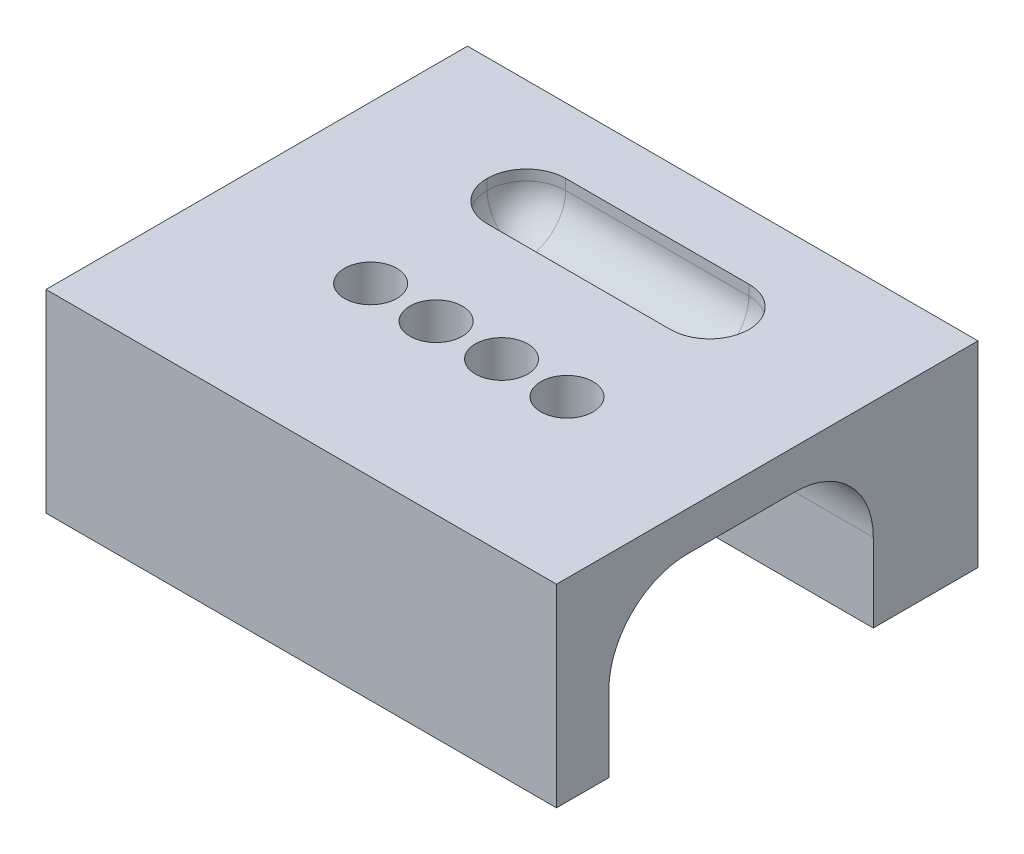
ISO-10303-21;
HEADER;
FILE_DESCRIPTION(('STEP AP214'),'2;1');
FILE_NAME('part.step','',(''),(''),'','','');
FILE_SCHEMA(('AUTOMOTIVE_DESIGN { 1 0 10303 214 1 1 1 1 }'));
ENDSEC;
DATA;
#1=APPLICATION_CONTEXT('core data for automotive mechanical design processes');
#2=APPLICATION_PROTOCOL_DEFINITION('international standard','automotive_design',2000,#1);
#3=PRODUCT_CONTEXT('',#1,'mechanical');
#4=PRODUCT('Part','Part','',(#3));
#5=PRODUCT_RELATED_PRODUCT_CATEGORY('part','',(#4));
#6=PRODUCT_DEFINITION_FORMATION('','',#4);
#7=PRODUCT_DEFINITION_CONTEXT('part definition',#1,'design');
#8=PRODUCT_DEFINITION('design','',#6,#7);
#9=PRODUCT_DEFINITION_SHAPE('','',#8);
#10=(LENGTH_UNIT() NAMED_UNIT(*) SI_UNIT(.MILLI.,.METRE.));
#11=(NAMED_UNIT(*) PLANE_ANGLE_UNIT() SI_UNIT($,.RADIAN.));
#12=(NAMED_UNIT(*) SI_UNIT($,.STERADIAN.) SOLID_ANGLE_UNIT());
#13=UNCERTAINTY_MEASURE_WITH_UNIT(LENGTH_MEASURE(1.E-05),#10,'distance_accuracy_value','');
#14=(GEOMETRIC_REPRESENTATION_CONTEXT(3) GLOBAL_UNCERTAINTY_ASSIGNED_CONTEXT((#13)) GLOBAL_UNIT_ASSIGNED_CONTEXT((#10,
#11,#12)) REPRESENTATION_CONTEXT('',''));
#15=CARTESIAN_POINT('',(0.,0.,0.));
#16=DIRECTION('',(0.,0.,1.));
#17=DIRECTION('',(1.,0.,0.));
#18=AXIS2_PLACEMENT_3D('',#15,#16,#17);
#19=CARTESIAN_POINT('',(4.75000000000001,-6.,0.));
#20=DIRECTION('',(0.,1.,0.));
#21=DIRECTION('',(0.,0.,1.));
#22=AXIS2_PLACEMENT_3D('',#19,#20,#21);
#23=CYLINDRICAL_SURFACE('',#22,1.);
#24=CARTESIAN_POINT('',(4.75000000000001,2.64,0.));
#25=DIRECTION('',(0.,-1.,0.));
#26=DIRECTION('',(0.,0.,-1.));
#27=AXIS2_PLACEMENT_3D('',#24,#25,#26);
#28=CIRCLE('',#27,1.);
#29=CARTESIAN_POINT('',(4.75000000000001,2.64,-1.));
#30=VERTEX_POINT('',#29);
#31=EDGE_CURVE('E164',#30,#30,#28,.F.);
#32=ORIENTED_EDGE('',*,*,#31,.F.);
#33=EDGE_LOOP('',(#32));
#34=FACE_BOUND('',#33,.T.);
#35=CARTESIAN_POINT('',(4.75000000000001,4.14,0.));
#36=DIRECTION('',(0.,1.,0.));
#37=DIRECTION('',(0.,0.,1.));
#38=AXIS2_PLACEMENT_3D('',#35,#36,#37);
#39=CIRCLE('',#38,1.);
#40=CARTESIAN_POINT('',(4.75000000000001,4.14,1.));
#41=VERTEX_POINT('',#40);
#42=EDGE_CURVE('E159',#41,#41,#39,.F.);
#43=ORIENTED_EDGE('',*,*,#42,.F.);
#44=EDGE_LOOP('',(#43));
#45=FACE_BOUND('',#44,.T.);
#46=ADVANCED_FACE('F47',(#34,#45),#23,.F.);
#47=CARTESIAN_POINT('',(-1.25,4.14,6.4));
#48=DIRECTION('',(0.,1.,0.));
#49=DIRECTION('',(0.,0.,1.));
#50=AXIS2_PLACEMENT_3D('',#47,#48,#49);
#51=PLANE('',#50);
#52=CARTESIAN_POINT('',(5.,4.14,-5.7));
#53=DIRECTION('',(0.,1.,0.));
#54=DIRECTION('',(0.,0.,1.));
#55=AXIS2_PLACEMENT_3D('',#52,#53,#54);
#56=CIRCLE('',#55,1.5);
#57=CARTESIAN_POINT('',(5.,4.14,-4.2));
#58=VERTEX_POINT('',#57);
#59=CARTESIAN_POINT('',(3.5,4.14,-5.7));
#60=VERTEX_POINT('',#59);
#61=EDGE_CURVE('E129',#58,#60,#56,.F.);
#62=ORIENTED_EDGE('',*,*,#61,.T.);
#63=CARTESIAN_POINT('',(5.,4.14,-5.7));
#64=DIRECTION('',(0.,1.,0.));
#65=DIRECTION('',(0.,0.,1.));
#66=AXIS2_PLACEMENT_3D('',#63,#64,#65);
#67=CIRCLE('',#66,1.5);
#68=CARTESIAN_POINT('',(5.,4.14,-7.2));
#69=VERTEX_POINT('',#68);
#70=EDGE_CURVE('E126',#60,#69,#67,.F.);
#71=ORIENTED_EDGE('',*,*,#70,.T.);
#72=DIRECTION('',(-1.,0.,0.));
#73=VECTOR('',#72,1.);
#74=CARTESIAN_POINT('',(3.5,4.14,-7.2));
#75=LINE('',#74,#73);
#76=CARTESIAN_POINT('',(12.,4.14,-7.2));
#77=VERTEX_POINT('',#76);
#78=EDGE_CURVE('E271',#77,#69,#75,.T.);
#79=ORIENTED_EDGE('',*,*,#78,.F.);
#80=CARTESIAN_POINT('',(12.,4.14,-5.7));
#81=DIRECTION('',(0.,1.,0.));
#82=DIRECTION('',(0.,0.,1.));
#83=AXIS2_PLACEMENT_3D('',#80,#81,#82);
#84=CIRCLE('',#83,1.5);
#85=CARTESIAN_POINT('',(13.5,4.14,-5.7));
#86=VERTEX_POINT('',#85);
#87=EDGE_CURVE('E57',#77,#86,#84,.F.);
#88=ORIENTED_EDGE('',*,*,#87,.T.);
#89=CARTESIAN_POINT('',(12.,4.14,-5.7));
#90=DIRECTION('',(0.,1.,0.));
#91=DIRECTION('',(0.,0.,1.));
#92=AXIS2_PLACEMENT_3D('',#89,#90,#91);
#93=CIRCLE('',#92,1.5);
#94=CARTESIAN_POINT('',(12.,4.14,-4.2));
#95=VERTEX_POINT('',#94);
#96=EDGE_CURVE('E12',#86,#95,#93,.F.);
#97=ORIENTED_EDGE('',*,*,#96,.T.);
#98=DIRECTION('',(1.,0.,0.));
#99=VECTOR('',#98,1.);
#100=CARTESIAN_POINT('',(3.5,4.14,-4.2));
#101=LINE('',#100,#99);
#102=EDGE_CURVE('E152',#58,#95,#101,.T.);
#103=ORIENTED_EDGE('',*,*,#102,.F.);
#104=EDGE_LOOP('',(#62,#71,#79,#88,#97,#103));
#105=FACE_BOUND('',#104,.T.);
#106=DIRECTION('',(1.,0.,0.));
#107=VECTOR('',#106,1.);
#108=CARTESIAN_POINT('',(-1.25,4.14,-9.7));
#109=LINE('',#108,#107);
#110=CARTESIAN_POINT('',(-1.25,4.14,-9.7));
#111=VERTEX_POINT('',#110);
#112=CARTESIAN_POINT('',(18.25,4.14,-9.7));
#113=VERTEX_POINT('',#112);
#114=EDGE_CURVE('E204',#111,#113,#109,.T.);
#115=ORIENTED_EDGE('',*,*,#114,.F.);
#116=DIRECTION('',(0.,0.,1.));
#117=VECTOR('',#116,1.);
#118=CARTESIAN_POINT('',(-1.25,4.14,6.4));
#119=LINE('',#118,#117);
#120=CARTESIAN_POINT('',(-1.25,4.14,6.4));
#121=VERTEX_POINT('',#120);
#122=EDGE_CURVE('E214',#111,#121,#119,.T.);
#123=ORIENTED_EDGE('',*,*,#122,.T.);
#124=DIRECTION('',(1.,0.,0.));
#125=VECTOR('',#124,1.);
#126=CARTESIAN_POINT('',(-1.25,4.14,6.4));
#127=LINE('',#126,#125);
#128=CARTESIAN_POINT('',(18.25,4.14,6.4));
#129=VERTEX_POINT('',#128);
#130=EDGE_CURVE('E207',#121,#129,#127,.T.);
#131=ORIENTED_EDGE('',*,*,#130,.T.);
#132=DIRECTION('',(0.,0.,1.));
#133=VECTOR('',#132,1.);
#134=CARTESIAN_POINT('',(18.25,4.14,6.4));
#135=LINE('',#134,#133);
#136=EDGE_CURVE('E244',#113,#129,#135,.T.);
#137=ORIENTED_EDGE('',*,*,#136,.F.);
#138=EDGE_LOOP('',(#115,#123,#131,#137));
#139=FACE_BOUND('',#138,.T.);
#140=ORIENTED_EDGE('',*,*,#42,.T.);
#141=EDGE_LOOP('',(#140));
#142=FACE_BOUND('',#141,.T.);
#143=CARTESIAN_POINT('',(7.25000000000001,4.14,0.));
#144=DIRECTION('',(0.,1.,0.));
#145=DIRECTION('',(0.,0.,1.));
#146=AXIS2_PLACEMENT_3D('',#143,#144,#145);
#147=CIRCLE('',#146,1.);
#148=CARTESIAN_POINT('',(7.25000000000001,4.14,1.));
#149=VERTEX_POINT('',#148);
#150=EDGE_CURVE('E162',#149,#149,#147,.F.);
#151=ORIENTED_EDGE('',*,*,#150,.T.);
#152=EDGE_LOOP('',(#151));
#153=FACE_BOUND('',#152,.T.);
#154=CARTESIAN_POINT('',(9.75000000000001,4.14,0.));
#155=DIRECTION('',(0.,1.,0.));
#156=DIRECTION('',(0.,0.,1.));
#157=AXIS2_PLACEMENT_3D('',#154,#155,#156);
#158=CIRCLE('',#157,1.);
#159=CARTESIAN_POINT('',(9.75000000000001,4.14,1.));
#160=VERTEX_POINT('',#159);
#161=EDGE_CURVE('E171',#160,#160,#158,.F.);
#162=ORIENTED_EDGE('',*,*,#161,.T.);
#163=EDGE_LOOP('',(#162));
#164=FACE_BOUND('',#163,.T.);
#165=CARTESIAN_POINT('',(12.25,4.14,0.));
#166=DIRECTION('',(0.,1.,0.));
#167=DIRECTION('',(0.,0.,1.));
#168=AXIS2_PLACEMENT_3D('',#165,#166,#167);
#169=CIRCLE('',#168,1.);
#170=CARTESIAN_POINT('',(12.25,4.14,1.));
#171=VERTEX_POINT('',#170);
#172=EDGE_CURVE('E158',#171,#171,#169,.F.);
#173=ORIENTED_EDGE('',*,*,#172,.T.);
#174=EDGE_LOOP('',(#173));
#175=FACE_BOUND('',#174,.T.);
#176=ADVANCED_FACE('F321',(#105,#139,#142,#153,#164,#175),#51,.T.);
#177=CARTESIAN_POINT('',(-1.25,2.64,0.));
#178=DIRECTION('',(0.,-1.,0.));
#179=DIRECTION('',(0.,0.,-1.));
#180=AXIS2_PLACEMENT_3D('',#177,#178,#179);
#181=PLANE('',#180);
#182=DIRECTION('',(1.,0.,0.));
#183=VECTOR('',#182,1.);
#184=CARTESIAN_POINT('',(-1.25,2.64,1.4));
#185=LINE('',#184,#183);
#186=CARTESIAN_POINT('',(-1.25,2.64,1.4));
#187=VERTEX_POINT('',#186);
#188=CARTESIAN_POINT('',(18.25,2.64,1.4));
#189=VERTEX_POINT('',#188);
#190=EDGE_CURVE('E189',#187,#189,#185,.T.);
#191=ORIENTED_EDGE('',*,*,#190,.F.);
#192=DIRECTION('',(0.,0.,-1.));
#193=VECTOR('',#192,1.);
#194=CARTESIAN_POINT('',(-1.25,2.64,1.4));
#195=LINE('',#194,#193);
#196=CARTESIAN_POINT('',(-1.25,2.64,-2.7));
#197=VERTEX_POINT('',#196);
#198=EDGE_CURVE('E229',#187,#197,#195,.T.);
#199=ORIENTED_EDGE('',*,*,#198,.T.);
#200=DIRECTION('',(1.,0.,0.));
#201=VECTOR('',#200,1.);
#202=CARTESIAN_POINT('',(-1.25,2.64,-2.7));
#203=LINE('',#202,#201);
#204=CARTESIAN_POINT('',(18.25,2.64,-2.7));
#205=VERTEX_POINT('',#204);
#206=EDGE_CURVE('E192',#197,#205,#203,.T.);
#207=ORIENTED_EDGE('',*,*,#206,.T.);
#208=DIRECTION('',(0.,0.,-1.));
#209=VECTOR('',#208,1.);
#210=CARTESIAN_POINT('',(18.25,2.64,1.4));
#211=LINE('',#210,#209);
#212=EDGE_CURVE('E259',#189,#205,#211,.T.);
#213=ORIENTED_EDGE('',*,*,#212,.F.);
#214=EDGE_LOOP('',(#191,#199,#207,#213));
#215=FACE_BOUND('',#214,.T.);
#216=ORIENTED_EDGE('',*,*,#31,.T.);
#217=EDGE_LOOP('',(#216));
#218=FACE_BOUND('',#217,.T.);
#219=CARTESIAN_POINT('',(7.25000000000001,2.64,0.));
#220=DIRECTION('',(0.,-1.,0.));
#221=DIRECTION('',(0.,0.,-1.));
#222=AXIS2_PLACEMENT_3D('',#219,#220,#221);
#223=CIRCLE('',#222,1.);
#224=CARTESIAN_POINT('',(7.25000000000001,2.64,-1.));
#225=VERTEX_POINT('',#224);
#226=EDGE_CURVE('E167',#225,#225,#223,.F.);
#227=ORIENTED_EDGE('',*,*,#226,.T.);
#228=EDGE_LOOP('',(#227));
#229=FACE_BOUND('',#228,.T.);
#230=CARTESIAN_POINT('',(9.75000000000001,2.64,0.));
#231=DIRECTION('',(0.,-1.,0.));
#232=DIRECTION('',(0.,0.,-1.));
#233=AXIS2_PLACEMENT_3D('',#230,#231,#232);
#234=CIRCLE('',#233,1.);
#235=CARTESIAN_POINT('',(9.75000000000001,2.64,-1.));
#236=VERTEX_POINT('',#235);
#237=EDGE_CURVE('E178',#236,#236,#234,.F.);
#238=ORIENTED_EDGE('',*,*,#237,.T.);
#239=EDGE_LOOP('',(#238));
#240=FACE_BOUND('',#239,.T.);
#241=CARTESIAN_POINT('',(12.25,2.64,0.));
#242=DIRECTION('',(0.,-1.,0.));
#243=DIRECTION('',(0.,0.,-1.));
#244=AXIS2_PLACEMENT_3D('',#241,#242,#243);
#245=CIRCLE('',#244,1.);
#246=CARTESIAN_POINT('',(12.25,2.64,-1.));
#247=VERTEX_POINT('',#246);
#248=EDGE_CURVE('E163',#247,#247,#245,.F.);
#249=ORIENTED_EDGE('',*,*,#248,.T.);
#250=EDGE_LOOP('',(#249));
#251=FACE_BOUND('',#250,.T.);
#252=ADVANCED_FACE('F324',(#215,#218,#229,#240,#251),#181,.T.);
#253=CARTESIAN_POINT('',(-1.25,-3.26,6.4));
#254=DIRECTION('',(0.,-1.,0.));
#255=DIRECTION('',(0.,0.,-1.));
#256=AXIS2_PLACEMENT_3D('',#253,#254,#255);
#257=PLANE('',#256);
#258=DIRECTION('',(1.,0.,0.));
#259=VECTOR('',#258,1.);
#260=CARTESIAN_POINT('',(-1.25,-3.26,6.4));
#261=LINE('',#260,#259);
#262=CARTESIAN_POINT('',(-1.25,-3.26,6.4));
#263=VERTEX_POINT('',#262);
#264=CARTESIAN_POINT('',(18.25,-3.26,6.4));
#265=VERTEX_POINT('',#264);
#266=EDGE_CURVE('E168',#263,#265,#261,.T.);
#267=ORIENTED_EDGE('',*,*,#266,.F.);
#268=DIRECTION('',(0.,0.,-1.));
#269=VECTOR('',#268,1.);
#270=CARTESIAN_POINT('',(-1.25,-3.26,6.4));
#271=LINE('',#270,#269);
#272=CARTESIAN_POINT('',(-1.25,-3.26,4.4));
#273=VERTEX_POINT('',#272);
#274=EDGE_CURVE('E238',#263,#273,#271,.T.);
#275=ORIENTED_EDGE('',*,*,#274,.T.);
#276=DIRECTION('',(1.,0.,0.));
#277=VECTOR('',#276,1.);
#278=CARTESIAN_POINT('',(-1.25,-3.26,4.4));
#279=LINE('',#278,#277);
#280=CARTESIAN_POINT('',(18.25,-3.26,4.4));
#281=VERTEX_POINT('',#280);
#282=EDGE_CURVE('E183',#273,#281,#279,.T.);
#283=ORIENTED_EDGE('',*,*,#282,.T.);
#284=DIRECTION('',(0.,0.,-1.));
#285=VECTOR('',#284,1.);
#286=CARTESIAN_POINT('',(18.25,-3.26,6.4));
#287=LINE('',#286,#285);
#288=EDGE_CURVE('E268',#265,#281,#287,.T.);
#289=ORIENTED_EDGE('',*,*,#288,.F.);
#290=EDGE_LOOP('',(#267,#275,#283,#289));
#291=FACE_BOUND('',#290,.T.);
#292=ADVANCED_FACE('F365',(#291),#257,.T.);
#293=CARTESIAN_POINT('',(-1.25,4.14,6.4));
#294=DIRECTION('',(0.,0.,1.));
#295=DIRECTION('',(0.,-1.,0.));
#296=AXIS2_PLACEMENT_3D('',#293,#294,#295);
#297=PLANE('',#296);
#298=ORIENTED_EDGE('',*,*,#130,.F.);
#299=DIRECTION('',(0.,-1.,0.));
#300=VECTOR('',#299,1.);
#301=CARTESIAN_POINT('',(-1.25,4.14,6.4));
#302=LINE('',#301,#300);
#303=EDGE_CURVE('E186',#121,#263,#302,.T.);
#304=ORIENTED_EDGE('',*,*,#303,.T.);
#305=ORIENTED_EDGE('',*,*,#266,.T.);
#306=DIRECTION('',(0.,-1.,0.));
#307=VECTOR('',#306,1.);
#308=CARTESIAN_POINT('',(18.25,4.14,6.4));
#309=LINE('',#308,#307);
#310=EDGE_CURVE('E241',#129,#265,#309,.T.);
#311=ORIENTED_EDGE('',*,*,#310,.F.);
#312=EDGE_LOOP('',(#298,#304,#305,#311));
#313=FACE_BOUND('',#312,.T.);
#314=ADVANCED_FACE('F387',(#313),#297,.T.);
#315=CARTESIAN_POINT('',(-1.25,4.14,-9.7));
#316=DIRECTION('',(0.,0.,-1.));
#317=DIRECTION('',(0.,1.,0.));
#318=AXIS2_PLACEMENT_3D('',#315,#316,#317);
#319=PLANE('',#318);
#320=DIRECTION('',(1.,0.,0.));
#321=VECTOR('',#320,1.);
#322=CARTESIAN_POINT('',(-1.25,-3.36,-9.7));
#323=LINE('',#322,#321);
#324=CARTESIAN_POINT('',(-1.25,-3.36,-9.7));
#325=VERTEX_POINT('',#324);
#326=CARTESIAN_POINT('',(18.25,-3.36,-9.7));
#327=VERTEX_POINT('',#326);
#328=EDGE_CURVE('E201',#325,#327,#323,.T.);
#329=ORIENTED_EDGE('',*,*,#328,.F.);
#330=DIRECTION('',(0.,1.,0.));
#331=VECTOR('',#330,1.);
#332=CARTESIAN_POINT('',(-1.25,4.14,-9.7));
#333=LINE('',#332,#331);
#334=EDGE_CURVE('E217',#325,#111,#333,.T.);
#335=ORIENTED_EDGE('',*,*,#334,.T.);
#336=ORIENTED_EDGE('',*,*,#114,.T.);
#337=DIRECTION('',(0.,1.,0.));
#338=VECTOR('',#337,1.);
#339=CARTESIAN_POINT('',(18.25,4.14,-9.7));
#340=LINE('',#339,#338);
#341=EDGE_CURVE('E247',#327,#113,#340,.T.);
#342=ORIENTED_EDGE('',*,*,#341,.F.);
#343=EDGE_LOOP('',(#329,#335,#336,#342));
#344=FACE_BOUND('',#343,.T.);
#345=ADVANCED_FACE('F455',(#344),#319,.T.);
#346=CARTESIAN_POINT('',(-1.25,-3.36,-9.7));
#347=DIRECTION('',(0.,-1.,0.));
#348=DIRECTION('',(0.,0.,-1.));
#349=AXIS2_PLACEMENT_3D('',#346,#347,#348);
#350=PLANE('',#349);
#351=DIRECTION('',(1.,0.,0.));
#352=VECTOR('',#351,1.);
#353=CARTESIAN_POINT('',(-1.25,-3.36,-5.7));
#354=LINE('',#353,#352);
#355=CARTESIAN_POINT('',(-1.25,-3.36,-5.7));
#356=VERTEX_POINT('',#355);
#357=CARTESIAN_POINT('',(18.25,-3.36,-5.7));
#358=VERTEX_POINT('',#357);
#359=EDGE_CURVE('E198',#356,#358,#354,.T.);
#360=ORIENTED_EDGE('',*,*,#359,.F.);
#361=DIRECTION('',(0.,0.,-1.));
#362=VECTOR('',#361,1.);
#363=CARTESIAN_POINT('',(-1.25,-3.36,-9.7));
#364=LINE('',#363,#362);
#365=EDGE_CURVE('E220',#356,#325,#364,.T.);
#366=ORIENTED_EDGE('',*,*,#365,.T.);
#367=ORIENTED_EDGE('',*,*,#328,.T.);
#368=DIRECTION('',(0.,0.,-1.));
#369=VECTOR('',#368,1.);
#370=CARTESIAN_POINT('',(18.25,-3.36,-9.7));
#371=LINE('',#370,#369);
#372=EDGE_CURVE('E250',#358,#327,#371,.T.);
#373=ORIENTED_EDGE('',*,*,#372,.F.);
#374=EDGE_LOOP('',(#360,#366,#367,#373));
#375=FACE_BOUND('',#374,.T.);
#376=ADVANCED_FACE('F467',(#375),#350,.T.);
#377=CARTESIAN_POINT('',(-1.25,-0.359999999999999,-5.7));
#378=DIRECTION('',(0.,0.,1.));
#379=DIRECTION('',(1.,0.,0.));
#380=AXIS2_PLACEMENT_3D('',#377,#378,#379);
#381=PLANE('',#380);
#382=DIRECTION('',(1.,0.,0.));
#383=VECTOR('',#382,1.);
#384=CARTESIAN_POINT('',(-1.25,-0.359999999999999,-5.7));
#385=LINE('',#384,#383);
#386=CARTESIAN_POINT('',(-1.25,-0.359999999999999,-5.7));
#387=VERTEX_POINT('',#386);
#388=CARTESIAN_POINT('',(18.25,-0.359999999999999,-5.7));
#389=VERTEX_POINT('',#388);
#390=EDGE_CURVE('E195',#387,#389,#385,.T.);
#391=ORIENTED_EDGE('',*,*,#390,.F.);
#392=DIRECTION('',(0.,-1.,0.));
#393=VECTOR('',#392,1.);
#394=CARTESIAN_POINT('',(-1.25,-0.359999999999999,-5.7));
#395=LINE('',#394,#393);
#396=EDGE_CURVE('E223',#387,#356,#395,.T.);
#397=ORIENTED_EDGE('',*,*,#396,.T.);
#398=ORIENTED_EDGE('',*,*,#359,.T.);
#399=DIRECTION('',(0.,-1.,0.));
#400=VECTOR('',#399,1.);
#401=CARTESIAN_POINT('',(18.25,-0.359999999999999,-5.7));
#402=LINE('',#401,#400);
#403=EDGE_CURVE('E253',#389,#358,#402,.T.);
#404=ORIENTED_EDGE('',*,*,#403,.F.);
#405=EDGE_LOOP('',(#391,#397,#398,#404));
#406=FACE_BOUND('',#405,.T.);
#407=ADVANCED_FACE('F400',(#406),#381,.T.);
#408=CARTESIAN_POINT('',(-1.25,-0.360000000000001,-2.7));
#409=DIRECTION('',(1.,0.,0.));
#410=DIRECTION('',(0.,0.,-1.));
#411=AXIS2_PLACEMENT_3D('',#408,#409,#410);
#412=CYLINDRICAL_SURFACE('',#411,3.);
#413=ORIENTED_EDGE('',*,*,#206,.F.);
#414=CARTESIAN_POINT('',(-1.25,-0.360000000000001,-2.7));
#415=DIRECTION('',(-1.,0.,0.));
#416=DIRECTION('',(0.,0.,1.));
#417=AXIS2_PLACEMENT_3D('',#414,#415,#416);
#418=CIRCLE('',#417,3.);
#419=EDGE_CURVE('E226',#197,#387,#418,.T.);
#420=ORIENTED_EDGE('',*,*,#419,.T.);
#421=ORIENTED_EDGE('',*,*,#390,.T.);
#422=CARTESIAN_POINT('',(18.25,-0.360000000000001,-2.7));
#423=DIRECTION('',(-1.,0.,0.));
#424=DIRECTION('',(0.,0.,1.));
#425=AXIS2_PLACEMENT_3D('',#422,#423,#424);
#426=CIRCLE('',#425,3.);
#427=EDGE_CURVE('E256',#205,#389,#426,.T.);
#428=ORIENTED_EDGE('',*,*,#427,.F.);
#429=EDGE_LOOP('',(#413,#420,#421,#428));
#430=FACE_BOUND('',#429,.T.);
#431=ADVANCED_FACE('F393',(#430),#412,.F.);
#432=CARTESIAN_POINT('',(-1.25,-0.359999999999999,1.4));
#433=DIRECTION('',(1.,0.,0.));
#434=DIRECTION('',(0.,0.,-1.));
#435=AXIS2_PLACEMENT_3D('',#432,#433,#434);
#436=CYLINDRICAL_SURFACE('',#435,3.);
#437=DIRECTION('',(1.,0.,0.));
#438=VECTOR('',#437,1.);
#439=CARTESIAN_POINT('',(-1.25,-0.359999999999999,4.4));
#440=LINE('',#439,#438);
#441=CARTESIAN_POINT('',(-1.25,-0.359999999999999,4.4));
#442=VERTEX_POINT('',#441);
#443=CARTESIAN_POINT('',(18.25,-0.359999999999998,4.4));
#444=VERTEX_POINT('',#443);
#445=EDGE_CURVE('E185',#442,#444,#440,.T.);
#446=ORIENTED_EDGE('',*,*,#445,.F.);
#447=CARTESIAN_POINT('',(-1.25,-0.359999999999999,1.4));
#448=DIRECTION('',(-1.,0.,0.));
#449=DIRECTION('',(0.,0.,-1.));
#450=AXIS2_PLACEMENT_3D('',#447,#448,#449);
#451=CIRCLE('',#450,3.);
#452=EDGE_CURVE('E232',#442,#187,#451,.T.);
#453=ORIENTED_EDGE('',*,*,#452,.T.);
#454=ORIENTED_EDGE('',*,*,#190,.T.);
#455=CARTESIAN_POINT('',(18.25,-0.359999999999999,1.4));
#456=DIRECTION('',(-1.,0.,0.));
#457=DIRECTION('',(0.,0.,-1.));
#458=AXIS2_PLACEMENT_3D('',#455,#456,#457);
#459=CIRCLE('',#458,3.);
#460=EDGE_CURVE('E262',#444,#189,#459,.T.);
#461=ORIENTED_EDGE('',*,*,#460,.F.);
#462=EDGE_LOOP('',(#446,#453,#454,#461));
#463=FACE_BOUND('',#462,.T.);
#464=ADVANCED_FACE('F373',(#463),#436,.F.);
#465=CARTESIAN_POINT('',(-1.25,-0.36,4.4));
#466=DIRECTION('',(0.,0.,-1.));
#467=DIRECTION('',(-1.,0.,0.));
#468=AXIS2_PLACEMENT_3D('',#465,#466,#467);
#469=PLANE('',#468);
#470=ORIENTED_EDGE('',*,*,#282,.F.);
#471=DIRECTION('',(0.,1.,0.));
#472=VECTOR('',#471,1.);
#473=CARTESIAN_POINT('',(-1.25,-0.36,4.4));
#474=LINE('',#473,#472);
#475=EDGE_CURVE('E235',#273,#442,#474,.T.);
#476=ORIENTED_EDGE('',*,*,#475,.T.);
#477=ORIENTED_EDGE('',*,*,#445,.T.);
#478=DIRECTION('',(0.,1.,0.));
#479=VECTOR('',#478,1.);
#480=CARTESIAN_POINT('',(18.25,-0.36,4.4));
#481=LINE('',#480,#479);
#482=EDGE_CURVE('E265',#281,#444,#481,.T.);
#483=ORIENTED_EDGE('',*,*,#482,.F.);
#484=EDGE_LOOP('',(#470,#476,#477,#483));
#485=FACE_BOUND('',#484,.T.);
#486=ADVANCED_FACE('F368',(#485),#469,.T.);
#487=CARTESIAN_POINT('',(7.25000000000001,-6.,0.));
#488=DIRECTION('',(0.,1.,0.));
#489=DIRECTION('',(0.,0.,1.));
#490=AXIS2_PLACEMENT_3D('',#487,#488,#489);
#491=CYLINDRICAL_SURFACE('',#490,1.);
#492=ORIENTED_EDGE('',*,*,#226,.F.);
#493=EDGE_LOOP('',(#492));
#494=FACE_BOUND('',#493,.T.);
#495=ORIENTED_EDGE('',*,*,#150,.F.);
#496=EDGE_LOOP('',(#495));
#497=FACE_BOUND('',#496,.T.);
#498=ADVANCED_FACE('F351',(#494,#497),#491,.F.);
#499=CARTESIAN_POINT('',(9.75000000000001,-6.,0.));
#500=DIRECTION('',(0.,1.,0.));
#501=DIRECTION('',(0.,0.,1.));
#502=AXIS2_PLACEMENT_3D('',#499,#500,#501);
#503=CYLINDRICAL_SURFACE('',#502,1.);
#504=ORIENTED_EDGE('',*,*,#237,.F.);
#505=EDGE_LOOP('',(#504));
#506=FACE_BOUND('',#505,.T.);
#507=ORIENTED_EDGE('',*,*,#161,.F.);
#508=EDGE_LOOP('',(#507));
#509=FACE_BOUND('',#508,.T.);
#510=ADVANCED_FACE('F341',(#506,#509),#503,.F.);
#511=CARTESIAN_POINT('',(12.25,-6.,0.));
#512=DIRECTION('',(0.,1.,0.));
#513=DIRECTION('',(0.,0.,1.));
#514=AXIS2_PLACEMENT_3D('',#511,#512,#513);
#515=CYLINDRICAL_SURFACE('',#514,1.);
#516=ORIENTED_EDGE('',*,*,#248,.F.);
#517=EDGE_LOOP('',(#516));
#518=FACE_BOUND('',#517,.T.);
#519=ORIENTED_EDGE('',*,*,#172,.F.);
#520=EDGE_LOOP('',(#519));
#521=FACE_BOUND('',#520,.T.);
#522=ADVANCED_FACE('F338',(#518,#521),#515,.F.);
#523=CARTESIAN_POINT('',(18.25,-6.,-12.));
#524=DIRECTION('',(1.,0.,0.));
#525=DIRECTION('',(0.,0.,-1.));
#526=AXIS2_PLACEMENT_3D('',#523,#524,#525);
#527=PLANE('',#526);
#528=ORIENTED_EDGE('',*,*,#310,.T.);
#529=ORIENTED_EDGE('',*,*,#288,.T.);
#530=ORIENTED_EDGE('',*,*,#482,.T.);
#531=ORIENTED_EDGE('',*,*,#460,.T.);
#532=ORIENTED_EDGE('',*,*,#212,.T.);
#533=ORIENTED_EDGE('',*,*,#427,.T.);
#534=ORIENTED_EDGE('',*,*,#403,.T.);
#535=ORIENTED_EDGE('',*,*,#372,.T.);
#536=ORIENTED_EDGE('',*,*,#341,.T.);
#537=ORIENTED_EDGE('',*,*,#136,.T.);
#538=EDGE_LOOP('',(#528,#529,#530,#531,#532,#533,#534,#535,#536,#537));
#539=FACE_BOUND('',#538,.T.);
#540=ADVANCED_FACE('F340',(#539),#527,.T.);
#541=CARTESIAN_POINT('',(-1.25,-6.,-12.));
#542=DIRECTION('',(-1.,0.,0.));
#543=DIRECTION('',(0.,0.,1.));
#544=AXIS2_PLACEMENT_3D('',#541,#542,#543);
#545=PLANE('',#544);
#546=ORIENTED_EDGE('',*,*,#475,.F.);
#547=ORIENTED_EDGE('',*,*,#274,.F.);
#548=ORIENTED_EDGE('',*,*,#303,.F.);
#549=ORIENTED_EDGE('',*,*,#122,.F.);
#550=ORIENTED_EDGE('',*,*,#334,.F.);
#551=ORIENTED_EDGE('',*,*,#365,.F.);
#552=ORIENTED_EDGE('',*,*,#396,.F.);
#553=ORIENTED_EDGE('',*,*,#419,.F.);
#554=ORIENTED_EDGE('',*,*,#198,.F.);
#555=ORIENTED_EDGE('',*,*,#452,.F.);
#556=EDGE_LOOP('',(#546,#547,#548,#549,#550,#551,#552,#553,#554,#555));
#557=FACE_BOUND('',#556,.T.);
#558=ADVANCED_FACE('F348',(#557),#545,.T.);
#559=CARTESIAN_POINT('',(3.5,-8.60030650891055,-4.2));
#560=DIRECTION('',(0.,0.,1.));
#561=DIRECTION('',(1.,0.,0.));
#562=AXIS2_PLACEMENT_3D('',#559,#560,#561);
#563=PLANE('',#562);
#564=DIRECTION('',(1.,0.,0.));
#565=VECTOR('',#564,1.);
#566=CARTESIAN_POINT('',(3.5,3.74,-4.2));
#567=LINE('',#566,#565);
#568=CARTESIAN_POINT('',(12.,3.74,-4.2));
#569=VERTEX_POINT('',#568);
#570=CARTESIAN_POINT('',(5.,3.74,-4.2));
#571=VERTEX_POINT('',#570);
#572=EDGE_CURVE('E149',#569,#571,#567,.F.);
#573=ORIENTED_EDGE('',*,*,#572,.T.);
#574=DIRECTION('',(0.,1.,0.));
#575=VECTOR('',#574,1.);
#576=CARTESIAN_POINT('',(5.,4.14,-4.2));
#577=LINE('',#576,#575);
#578=EDGE_CURVE('E143',#571,#58,#577,.T.);
#579=ORIENTED_EDGE('',*,*,#578,.T.);
#580=ORIENTED_EDGE('',*,*,#102,.T.);
#581=DIRECTION('',(0.,1.,0.));
#582=VECTOR('',#581,1.);
#583=CARTESIAN_POINT('',(12.,3.74,-4.2));
#584=LINE('',#583,#582);
#585=EDGE_CURVE('E146',#95,#569,#584,.F.);
#586=ORIENTED_EDGE('',*,*,#585,.T.);
#587=EDGE_LOOP('',(#573,#579,#580,#586));
#588=FACE_BOUND('',#587,.T.);
#589=ADVANCED_FACE('F311',(#588),#563,.F.);
#590=CARTESIAN_POINT('',(3.5,-8.60030650891055,-7.2));
#591=DIRECTION('',(0.,0.,-1.));
#592=DIRECTION('',(-1.,0.,0.));
#593=AXIS2_PLACEMENT_3D('',#590,#591,#592);
#594=PLANE('',#593);
#595=ORIENTED_EDGE('',*,*,#78,.T.);
#596=DIRECTION('',(0.,1.,0.));
#597=VECTOR('',#596,1.);
#598=CARTESIAN_POINT('',(5.,3.74,-7.2));
#599=LINE('',#598,#597);
#600=CARTESIAN_POINT('',(5.,3.74,-7.2));
#601=VERTEX_POINT('',#600);
#602=EDGE_CURVE('E139',#69,#601,#599,.F.);
#603=ORIENTED_EDGE('',*,*,#602,.T.);
#604=DIRECTION('',(-1.,0.,0.));
#605=VECTOR('',#604,1.);
#606=CARTESIAN_POINT('',(13.5,3.74,-7.2));
#607=LINE('',#606,#605);
#608=CARTESIAN_POINT('',(12.,3.74,-7.2));
#609=VERTEX_POINT('',#608);
#610=EDGE_CURVE('E155',#601,#609,#607,.F.);
#611=ORIENTED_EDGE('',*,*,#610,.T.);
#612=DIRECTION('',(0.,1.,0.));
#613=VECTOR('',#612,1.);
#614=CARTESIAN_POINT('',(12.,4.14,-7.2));
#615=LINE('',#614,#613);
#616=EDGE_CURVE('E113',#609,#77,#615,.T.);
#617=ORIENTED_EDGE('',*,*,#616,.T.);
#618=EDGE_LOOP('',(#595,#603,#611,#617));
#619=FACE_BOUND('',#618,.T.);
#620=ADVANCED_FACE('F278',(#619),#594,.F.);
#621=CARTESIAN_POINT('',(-1.25,3.74,-5.7));
#622=DIRECTION('',(-1.,0.,0.));
#623=DIRECTION('',(0.,0.,1.));
#624=AXIS2_PLACEMENT_3D('',#621,#622,#623);
#625=CYLINDRICAL_SURFACE('',#624,1.5);
#626=ORIENTED_EDGE('',*,*,#572,.F.);
#627=CARTESIAN_POINT('',(12.,3.74,-5.7));
#628=DIRECTION('',(-1.,0.,0.));
#629=DIRECTION('',(0.,0.,1.));
#630=AXIS2_PLACEMENT_3D('',#627,#628,#629);
#631=CIRCLE('',#630,1.5);
#632=CARTESIAN_POINT('',(12.,2.24,-5.7));
#633=VERTEX_POINT('',#632);
#634=EDGE_CURVE('E92',#569,#633,#631,.F.);
#635=ORIENTED_EDGE('',*,*,#634,.T.);
#636=DIRECTION('',(1.,0.,0.));
#637=VECTOR('',#636,1.);
#638=CARTESIAN_POINT('',(13.5,2.24,-5.7));
#639=LINE('',#638,#637);
#640=CARTESIAN_POINT('',(5.,2.24,-5.7));
#641=VERTEX_POINT('',#640);
#642=EDGE_CURVE('E117',#641,#633,#639,.T.);
#643=ORIENTED_EDGE('',*,*,#642,.F.);
#644=CARTESIAN_POINT('',(5.,3.74,-5.7));
#645=DIRECTION('',(-1.,0.,0.));
#646=DIRECTION('',(0.,0.,1.));
#647=AXIS2_PLACEMENT_3D('',#644,#645,#646);
#648=CIRCLE('',#647,1.5);
#649=EDGE_CURVE('E132',#641,#571,#648,.T.);
#650=ORIENTED_EDGE('',*,*,#649,.T.);
#651=EDGE_LOOP('',(#626,#635,#643,#650));
#652=FACE_BOUND('',#651,.T.);
#653=ADVANCED_FACE('F299',(#652),#625,.F.);
#654=CARTESIAN_POINT('',(-1.25,3.74,-5.7));
#655=DIRECTION('',(1.,0.,0.));
#656=DIRECTION('',(0.,0.,-1.));
#657=AXIS2_PLACEMENT_3D('',#654,#655,#656);
#658=CYLINDRICAL_SURFACE('',#657,1.5);
#659=ORIENTED_EDGE('',*,*,#610,.F.);
#660=CARTESIAN_POINT('',(5.,3.74,-5.7));
#661=DIRECTION('',(1.,0.,0.));
#662=DIRECTION('',(0.,0.,-1.));
#663=AXIS2_PLACEMENT_3D('',#660,#661,#662);
#664=CIRCLE('',#663,1.5);
#665=EDGE_CURVE('E135',#601,#641,#664,.F.);
#666=ORIENTED_EDGE('',*,*,#665,.T.);
#667=ORIENTED_EDGE('',*,*,#642,.T.);
#668=CARTESIAN_POINT('',(12.,3.74,-5.7));
#669=DIRECTION('',(1.,0.,0.));
#670=DIRECTION('',(0.,0.,-1.));
#671=AXIS2_PLACEMENT_3D('',#668,#669,#670);
#672=CIRCLE('',#671,1.5);
#673=EDGE_CURVE('E105',#633,#609,#672,.T.);
#674=ORIENTED_EDGE('',*,*,#673,.T.);
#675=EDGE_LOOP('',(#659,#666,#667,#674));
#676=FACE_BOUND('',#675,.T.);
#677=ADVANCED_FACE('F301',(#676),#658,.F.);
#678=CARTESIAN_POINT('',(5.,3.74,-5.7));
#679=DIRECTION('',(-1.,0.,0.));
#680=DIRECTION('',(0.,0.,1.));
#681=AXIS2_PLACEMENT_3D('',#678,#679,#680);
#682=SPHERICAL_SURFACE('',#681,1.5);
#683=CARTESIAN_POINT('',(5.,3.74,-5.7));
#684=DIRECTION('',(0.,0.,-1.));
#685=DIRECTION('',(0.,1.,0.));
#686=AXIS2_PLACEMENT_3D('',#683,#684,#685);
#687=CIRCLE('',#686,1.5);
#688=CARTESIAN_POINT('',(3.5,3.74,-5.7));
#689=VERTEX_POINT('',#688);
#690=EDGE_CURVE('E118',#641,#689,#687,.T.);
#691=ORIENTED_EDGE('',*,*,#690,.F.);
#692=ORIENTED_EDGE('',*,*,#665,.F.);
#693=CARTESIAN_POINT('',(5.,3.74,-5.7));
#694=DIRECTION('',(0.,-1.,0.));
#695=DIRECTION('',(0.,0.,-1.));
#696=AXIS2_PLACEMENT_3D('',#693,#694,#695);
#697=CIRCLE('',#696,1.5);
#698=EDGE_CURVE('E77',#689,#601,#697,.T.);
#699=ORIENTED_EDGE('',*,*,#698,.F.);
#700=EDGE_LOOP('',(#691,#692,#699));
#701=FACE_BOUND('',#700,.T.);
#702=ADVANCED_FACE('F302',(#701),#682,.F.);
#703=CARTESIAN_POINT('',(5.,-8.60030650891055,-5.7));
#704=DIRECTION('',(0.,-1.,0.));
#705=DIRECTION('',(0.,0.,-1.));
#706=AXIS2_PLACEMENT_3D('',#703,#704,#705);
#707=CYLINDRICAL_SURFACE('',#706,1.5);
#708=ORIENTED_EDGE('',*,*,#602,.F.);
#709=ORIENTED_EDGE('',*,*,#70,.F.);
#710=DIRECTION('',(0.,1.,0.));
#711=VECTOR('',#710,1.);
#712=CARTESIAN_POINT('',(3.5,4.14,-5.7));
#713=LINE('',#712,#711);
#714=EDGE_CURVE('E120',#689,#60,#713,.T.);
#715=ORIENTED_EDGE('',*,*,#714,.F.);
#716=ORIENTED_EDGE('',*,*,#698,.T.);
#717=EDGE_LOOP('',(#708,#709,#715,#716));
#718=FACE_BOUND('',#717,.T.);
#719=ADVANCED_FACE('F286',(#718),#707,.F.);
#720=CARTESIAN_POINT('',(5.,3.74,-5.7));
#721=DIRECTION('',(-1.,0.,0.));
#722=DIRECTION('',(0.,0.,1.));
#723=AXIS2_PLACEMENT_3D('',#720,#721,#722);
#724=SPHERICAL_SURFACE('',#723,1.5);
#725=ORIENTED_EDGE('',*,*,#649,.F.);
#726=ORIENTED_EDGE('',*,*,#690,.T.);
#727=CARTESIAN_POINT('',(5.,3.74,-5.7));
#728=DIRECTION('',(0.,-1.,0.));
#729=DIRECTION('',(0.,0.,-1.));
#730=AXIS2_PLACEMENT_3D('',#727,#728,#729);
#731=CIRCLE('',#730,1.5);
#732=EDGE_CURVE('E96',#571,#689,#731,.T.);
#733=ORIENTED_EDGE('',*,*,#732,.F.);
#734=EDGE_LOOP('',(#725,#726,#733));
#735=FACE_BOUND('',#734,.T.);
#736=ADVANCED_FACE('F306',(#735),#724,.F.);
#737=CARTESIAN_POINT('',(5.,-8.60030650891055,-5.7));
#738=DIRECTION('',(0.,-1.,0.));
#739=DIRECTION('',(0.,0.,-1.));
#740=AXIS2_PLACEMENT_3D('',#737,#738,#739);
#741=CYLINDRICAL_SURFACE('',#740,1.5);
#742=ORIENTED_EDGE('',*,*,#732,.T.);
#743=ORIENTED_EDGE('',*,*,#714,.T.);
#744=ORIENTED_EDGE('',*,*,#61,.F.);
#745=ORIENTED_EDGE('',*,*,#578,.F.);
#746=EDGE_LOOP('',(#742,#743,#744,#745));
#747=FACE_BOUND('',#746,.T.);
#748=ADVANCED_FACE('F320',(#747),#741,.F.);
#749=CARTESIAN_POINT('',(12.,3.74,-5.7));
#750=DIRECTION('',(1.,0.,0.));
#751=DIRECTION('',(0.,0.,-1.));
#752=AXIS2_PLACEMENT_3D('',#749,#750,#751);
#753=SPHERICAL_SURFACE('',#752,1.5);
#754=CARTESIAN_POINT('',(12.,3.74,-5.7));
#755=DIRECTION('',(0.,0.,1.));
#756=DIRECTION('',(1.,0.,0.));
#757=AXIS2_PLACEMENT_3D('',#754,#755,#756);
#758=CIRCLE('',#757,1.5);
#759=CARTESIAN_POINT('',(13.5,3.74,-5.7));
#760=VERTEX_POINT('',#759);
#761=EDGE_CURVE('E88',#633,#760,#758,.T.);
#762=ORIENTED_EDGE('',*,*,#761,.F.);
#763=ORIENTED_EDGE('',*,*,#634,.F.);
#764=CARTESIAN_POINT('',(12.,3.74,-5.7));
#765=DIRECTION('',(0.,-1.,0.));
#766=DIRECTION('',(0.,0.,-1.));
#767=AXIS2_PLACEMENT_3D('',#764,#765,#766);
#768=CIRCLE('',#767,1.5);
#769=EDGE_CURVE('E51',#760,#569,#768,.T.);
#770=ORIENTED_EDGE('',*,*,#769,.F.);
#771=EDGE_LOOP('',(#762,#763,#770));
#772=FACE_BOUND('',#771,.T.);
#773=ADVANCED_FACE('F49',(#772),#753,.F.);
#774=CARTESIAN_POINT('',(12.,-8.60030650891055,-5.7));
#775=DIRECTION('',(0.,-1.,0.));
#776=DIRECTION('',(0.,0.,-1.));
#777=AXIS2_PLACEMENT_3D('',#774,#775,#776);
#778=CYLINDRICAL_SURFACE('',#777,1.5);
#779=ORIENTED_EDGE('',*,*,#585,.F.);
#780=ORIENTED_EDGE('',*,*,#96,.F.);
#781=DIRECTION('',(0.,1.,0.));
#782=VECTOR('',#781,1.);
#783=CARTESIAN_POINT('',(13.5,4.14,-5.7));
#784=LINE('',#783,#782);
#785=EDGE_CURVE('E106',#760,#86,#784,.T.);
#786=ORIENTED_EDGE('',*,*,#785,.F.);
#787=ORIENTED_EDGE('',*,*,#769,.T.);
#788=EDGE_LOOP('',(#779,#780,#786,#787));
#789=FACE_BOUND('',#788,.T.);
#790=ADVANCED_FACE('F108',(#789),#778,.F.);
#791=CARTESIAN_POINT('',(12.,3.74,-5.7));
#792=DIRECTION('',(1.,0.,0.));
#793=DIRECTION('',(0.,0.,-1.));
#794=AXIS2_PLACEMENT_3D('',#791,#792,#793);
#795=SPHERICAL_SURFACE('',#794,1.5);
#796=ORIENTED_EDGE('',*,*,#673,.F.);
#797=ORIENTED_EDGE('',*,*,#761,.T.);
#798=CARTESIAN_POINT('',(12.,3.74,-5.7));
#799=DIRECTION('',(0.,-1.,0.));
#800=DIRECTION('',(0.,0.,-1.));
#801=AXIS2_PLACEMENT_3D('',#798,#799,#800);
#802=CIRCLE('',#801,1.5);
#803=EDGE_CURVE('E102',#609,#760,#802,.T.);
#804=ORIENTED_EDGE('',*,*,#803,.F.);
#805=EDGE_LOOP('',(#796,#797,#804));
#806=FACE_BOUND('',#805,.T.);
#807=ADVANCED_FACE('F99',(#806),#795,.F.);
#808=CARTESIAN_POINT('',(12.,-8.60030650891055,-5.7));
#809=DIRECTION('',(0.,-1.,0.));
#810=DIRECTION('',(0.,0.,-1.));
#811=AXIS2_PLACEMENT_3D('',#808,#809,#810);
#812=CYLINDRICAL_SURFACE('',#811,1.5);
#813=ORIENTED_EDGE('',*,*,#803,.T.);
#814=ORIENTED_EDGE('',*,*,#785,.T.);
#815=ORIENTED_EDGE('',*,*,#87,.F.);
#816=ORIENTED_EDGE('',*,*,#616,.F.);
#817=EDGE_LOOP('',(#813,#814,#815,#816));
#818=FACE_BOUND('',#817,.T.);
#819=ADVANCED_FACE('F111',(#818),#812,.F.);
#820=CLOSED_SHELL('',(#46,#176,#252,#292,#314,#345,#376,#407,#431,#464,#486,#498,#510,#522,#540,
#558,#589,#620,#653,#677,#702,#719,#736,#748,#773,#790,#807,#819));
#821=MANIFOLD_SOLID_BREP('B2',#820);
#822=ADVANCED_BREP_SHAPE_REPRESENTATION('',(#18,#821),#14);
#823=SHAPE_DEFINITION_REPRESENTATION(#9,#822);
ENDSEC;
END-ISO-10303-21;
